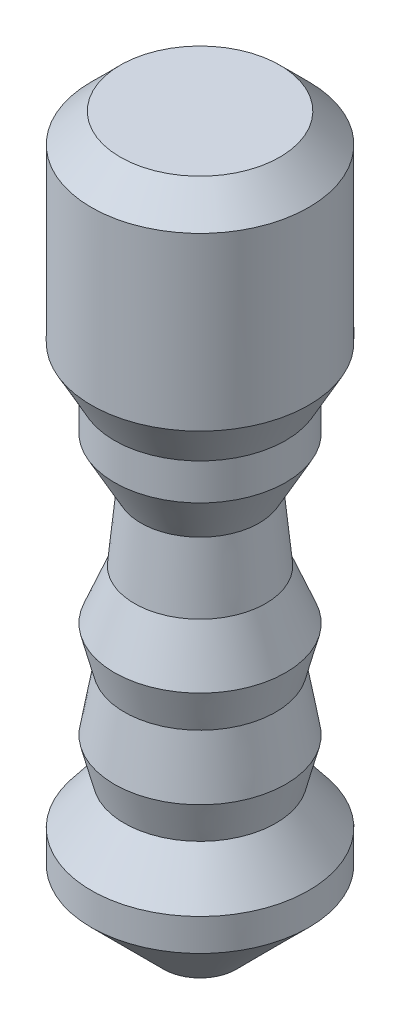
ISO-10303-21;
HEADER;
FILE_DESCRIPTION(('STEP AP214'),'2;1');
FILE_NAME('part.step','',(''),(''),'','','');
FILE_SCHEMA(('AUTOMOTIVE_DESIGN { 1 0 10303 214 1 1 1 1 }'));
ENDSEC;
DATA;
#1=APPLICATION_CONTEXT('core data for automotive mechanical design processes');
#2=APPLICATION_PROTOCOL_DEFINITION('international standard','automotive_design',2000,#1);
#3=PRODUCT_CONTEXT('',#1,'mechanical');
#4=PRODUCT('Part','Part','',(#3));
#5=PRODUCT_RELATED_PRODUCT_CATEGORY('part','',(#4));
#6=PRODUCT_DEFINITION_FORMATION('','',#4);
#7=PRODUCT_DEFINITION_CONTEXT('part definition',#1,'design');
#8=PRODUCT_DEFINITION('design','',#6,#7);
#9=PRODUCT_DEFINITION_SHAPE('','',#8);
#10=(LENGTH_UNIT() NAMED_UNIT(*) SI_UNIT(.MILLI.,.METRE.));
#11=(NAMED_UNIT(*) PLANE_ANGLE_UNIT() SI_UNIT($,.RADIAN.));
#12=(NAMED_UNIT(*) SI_UNIT($,.STERADIAN.) SOLID_ANGLE_UNIT());
#13=UNCERTAINTY_MEASURE_WITH_UNIT(LENGTH_MEASURE(1.E-05),#10,'distance_accuracy_value','');
#14=(GEOMETRIC_REPRESENTATION_CONTEXT(3) GLOBAL_UNCERTAINTY_ASSIGNED_CONTEXT((#13)) GLOBAL_UNIT_ASSIGNED_CONTEXT((#10,
#11,#12)) REPRESENTATION_CONTEXT('',''));
#15=CARTESIAN_POINT('',(0.,0.,0.));
#16=DIRECTION('',(0.,0.,1.));
#17=DIRECTION('',(1.,0.,0.));
#18=AXIS2_PLACEMENT_3D('',#15,#16,#17);
#19=CARTESIAN_POINT('',(0.,50.,0.));
#20=DIRECTION('',(0.,-1.,0.));
#21=DIRECTION('',(0.,0.,-1.));
#22=AXIS2_PLACEMENT_3D('',#19,#20,#21);
#23=CYLINDRICAL_SURFACE('',#22,7.5);
#24=CARTESIAN_POINT('',(0.,7.20813186441516,0.));
#25=DIRECTION('',(0.,-1.,0.));
#26=DIRECTION('',(0.,0.,-1.));
#27=AXIS2_PLACEMENT_3D('',#24,#25,#26);
#28=CIRCLE('',#27,7.5);
#29=CARTESIAN_POINT('',(0.,7.20813186441516,-7.5));
#30=VERTEX_POINT('',#29);
#31=EDGE_CURVE('E68',#30,#30,#28,.T.);
#32=ORIENTED_EDGE('',*,*,#31,.T.);
#33=EDGE_LOOP('',(#32));
#34=FACE_BOUND('',#33,.T.);
#35=CARTESIAN_POINT('',(0.,5.00000000000001,0.));
#36=DIRECTION('',(0.,1.,0.));
#37=DIRECTION('',(0.,0.,1.));
#38=AXIS2_PLACEMENT_3D('',#35,#36,#37);
#39=CIRCLE('',#38,7.5);
#40=CARTESIAN_POINT('',(0.,5.00000000000001,7.5));
#41=VERTEX_POINT('',#40);
#42=EDGE_CURVE('E62',#41,#41,#39,.T.);
#43=ORIENTED_EDGE('',*,*,#42,.T.);
#44=EDGE_LOOP('',(#43));
#45=FACE_BOUND('',#44,.T.);
#46=ADVANCED_FACE('F43',(#34,#45),#23,.T.);
#47=CARTESIAN_POINT('',(0.,0.,0.));
#48=DIRECTION('',(0.,1.,0.));
#49=DIRECTION('',(0.,0.,1.));
#50=AXIS2_PLACEMENT_3D('',#47,#48,#49);
#51=PLANE('',#50);
#52=CARTESIAN_POINT('',(0.,0.,0.));
#53=DIRECTION('',(0.,1.,0.));
#54=DIRECTION('',(0.,0.,1.));
#55=AXIS2_PLACEMENT_3D('',#52,#53,#54);
#56=CIRCLE('',#55,2.49999999999997);
#57=CARTESIAN_POINT('',(0.,0.,2.49999999999997));
#58=VERTEX_POINT('',#57);
#59=EDGE_CURVE('E57',#58,#58,#56,.F.);
#60=ORIENTED_EDGE('',*,*,#59,.T.);
#61=EDGE_LOOP('',(#60));
#62=FACE_BOUND('',#61,.T.);
#63=ADVANCED_FACE('F121',(#62),#51,.F.);
#64=CARTESIAN_POINT('',(0.,5.00000000000001,0.));
#65=DIRECTION('',(0.,1.,0.));
#66=DIRECTION('',(0.,0.,1.));
#67=AXIS2_PLACEMENT_3D('',#64,#65,#66);
#68=CONICAL_SURFACE('',#67,7.5,0.78539816339745);
#69=CARTESIAN_POINT('',(0.,0.,2.49999999999997));
#70=CARTESIAN_POINT('',(0.,0.0520833333333331,2.5520833333333));
#71=CARTESIAN_POINT('',(0.,0.104166666666667,2.60416666666664));
#72=CARTESIAN_POINT('',(0.,0.208333333333334,2.7083333333333));
#73=CARTESIAN_POINT('',(0.,0.260416666666667,2.76041666666664));
#74=CARTESIAN_POINT('',(0.,0.364583333333334,2.8645833333333));
#75=CARTESIAN_POINT('',(0.,0.416666666666668,2.91666666666664));
#76=CARTESIAN_POINT('',(0.,0.520833333333335,3.02083333333331));
#77=CARTESIAN_POINT('',(0.,0.572916666666668,3.07291666666664));
#78=CARTESIAN_POINT('',(0.,0.677083333333335,3.17708333333331));
#79=CARTESIAN_POINT('',(0.,0.729166666666668,3.22916666666664));
#80=CARTESIAN_POINT('',(0.,0.833333333333335,3.33333333333331));
#81=CARTESIAN_POINT('',(0.,0.885416666666668,3.38541666666664));
#82=CARTESIAN_POINT('',(0.,0.989583333333335,3.48958333333331));
#83=CARTESIAN_POINT('',(0.,1.04166666666667,3.54166666666664));
#84=CARTESIAN_POINT('',(0.,1.14583333333334,3.64583333333331));
#85=CARTESIAN_POINT('',(0.,1.19791666666667,3.69791666666664));
#86=CARTESIAN_POINT('',(0.,1.30208333333334,3.80208333333331));
#87=CARTESIAN_POINT('',(0.,1.35416666666667,3.85416666666664));
#88=CARTESIAN_POINT('',(0.,1.45833333333334,3.95833333333331));
#89=CARTESIAN_POINT('',(0.,1.51041666666667,4.01041666666664));
#90=CARTESIAN_POINT('',(0.,1.61458333333334,4.11458333333331));
#91=CARTESIAN_POINT('',(0.,1.66666666666667,4.16666666666665));
#92=CARTESIAN_POINT('',(0.,1.77083333333334,4.27083333333331));
#93=CARTESIAN_POINT('',(0.,1.82291666666667,4.32291666666665));
#94=CARTESIAN_POINT('',(0.,1.92708333333334,4.42708333333331));
#95=CARTESIAN_POINT('',(0.,1.97916666666667,4.47916666666665));
#96=CARTESIAN_POINT('',(0.,2.08333333333334,4.58333333333332));
#97=CARTESIAN_POINT('',(0.,2.13541666666667,4.63541666666665));
#98=CARTESIAN_POINT('',(0.,2.23958333333334,4.73958333333332));
#99=CARTESIAN_POINT('',(0.,2.29166666666667,4.79166666666665));
#100=CARTESIAN_POINT('',(0.,2.39583333333334,4.89583333333332));
#101=CARTESIAN_POINT('',(0.,2.44791666666667,4.94791666666665));
#102=CARTESIAN_POINT('',(0.,2.55208333333334,5.05208333333332));
#103=CARTESIAN_POINT('',(0.,2.60416666666667,5.10416666666665));
#104=CARTESIAN_POINT('',(0.,2.70833333333334,5.20833333333332));
#105=CARTESIAN_POINT('',(0.,2.76041666666667,5.26041666666665));
#106=CARTESIAN_POINT('',(0.,2.86458333333334,5.36458333333332));
#107=CARTESIAN_POINT('',(0.,2.91666666666667,5.41666666666665));
#108=CARTESIAN_POINT('',(0.,3.02083333333334,5.52083333333332));
#109=CARTESIAN_POINT('',(0.,3.07291666666667,5.57291666666665));
#110=CARTESIAN_POINT('',(0.,3.17708333333334,5.67708333333332));
#111=CARTESIAN_POINT('',(0.,3.22916666666667,5.72916666666665));
#112=CARTESIAN_POINT('',(0.,3.33333333333334,5.83333333333332));
#113=CARTESIAN_POINT('',(0.,3.38541666666667,5.88541666666666));
#114=CARTESIAN_POINT('',(0.,3.48958333333334,5.98958333333332));
#115=CARTESIAN_POINT('',(0.,3.54166666666667,6.04166666666666));
#116=CARTESIAN_POINT('',(0.,3.64583333333334,6.14583333333332));
#117=CARTESIAN_POINT('',(0.,3.69791666666667,6.19791666666666));
#118=CARTESIAN_POINT('',(0.,3.80208333333334,6.30208333333332));
#119=CARTESIAN_POINT('',(0.,3.85416666666667,6.35416666666666));
#120=CARTESIAN_POINT('',(0.,3.95833333333334,6.45833333333333));
#121=CARTESIAN_POINT('',(0.,4.01041666666667,6.51041666666666));
#122=CARTESIAN_POINT('',(0.,4.11458333333334,6.61458333333333));
#123=CARTESIAN_POINT('',(0.,4.16666666666667,6.66666666666666));
#124=CARTESIAN_POINT('',(0.,4.27083333333334,6.77083333333333));
#125=CARTESIAN_POINT('',(0.,4.32291666666668,6.82291666666666));
#126=CARTESIAN_POINT('',(0.,4.42708333333334,6.92708333333333));
#127=CARTESIAN_POINT('',(0.,4.47916666666668,6.97916666666666));
#128=CARTESIAN_POINT('',(0.,4.58333333333334,7.08333333333333));
#129=CARTESIAN_POINT('',(0.,4.63541666666668,7.13541666666666));
#130=CARTESIAN_POINT('',(0.,4.73958333333334,7.23958333333333));
#131=CARTESIAN_POINT('',(0.,4.79166666666668,7.29166666666666));
#132=CARTESIAN_POINT('',(0.,4.89583333333334,7.39583333333333));
#133=CARTESIAN_POINT('',(0.,4.94791666666668,7.44791666666667));
#134=CARTESIAN_POINT('',(0.,5.00000000000001,7.5));
#135=B_SPLINE_CURVE_WITH_KNOTS('',3,(#69,#70,#71,#72,#73,#74,#75,#76,#77,#78,#79,#80,#81,#82,
#83,#84,#85,#86,#87,#88,#89,#90,#91,#92,#93,#94,#95,#96,#97,#98,#99,#100,#101,#102,#103,#104,
#105,#106,#107,#108,#109,#110,#111,#112,#113,#114,#115,#116,#117,#118,#119,#120,#121,#122,#123,
#124,#125,#126,#127,#128,#129,#130,#131,#132,#133,#134),.UNSPECIFIED.,.F.,.F.,(4,2,2,2,2,2,2,2,
2,2,2,2,2,2,2,2,2,2,2,2,2,2,2,2,2,2,2,2,2,2,2,2,4),(0.,0.220970869120797,0.441941738241593,
0.662912607362391,0.883883476483188,1.10485434560399,1.32582521472478,1.54679608384558,
1.76776695296638,1.98873782208717,2.20970869120797,2.43067956032877,2.65165042944956,
2.87262129857036,3.09359216769116,3.31456303681196,3.53553390593275,3.75650477505355,
3.97747564417435,4.19844651329514,4.41941738241594,4.64038825153674,4.86135912065753,
5.08232998977833,5.30330085889913,5.52427172801992,5.74524259714072,5.96621346626152,
6.18718433538232,6.40815520450311,6.62912607362391,6.85009694274471,7.0710678118655),.UNSPECIFIED.);
#136=EDGE_CURVE('BSEAM126',#58,#41,#135,.T.);
#137=ORIENTED_EDGE('',*,*,#59,.F.);
#138=ORIENTED_EDGE('',*,*,#42,.F.);
#139=ORIENTED_EDGE('',*,*,#136,.T.);
#140=ORIENTED_EDGE('',*,*,#136,.F.);
#141=EDGE_LOOP('',(#137,#139,#138,#140));
#142=FACE_BOUND('',#141,.T.);
#143=ADVANCED_FACE('F126',(#142),#68,.T.);
#144=CARTESIAN_POINT('',(0.,10.0865747204222,0.));
#145=DIRECTION('',(0.,-1.,0.));
#146=DIRECTION('',(0.,0.,-1.));
#147=AXIS2_PLACEMENT_3D('',#144,#145,#146);
#148=CONICAL_SURFACE('',#147,5.22558542013019,0.668708691288029);
#149=ORIENTED_EDGE('',*,*,#31,.F.);
#150=EDGE_LOOP('',(#149));
#151=FACE_BOUND('',#150,.T.);
#152=CARTESIAN_POINT('',(0.,10.0865747204222,0.));
#153=DIRECTION('',(0.,-1.,0.));
#154=DIRECTION('',(0.,0.,-1.));
#155=AXIS2_PLACEMENT_3D('',#152,#153,#154);
#156=CIRCLE('',#155,5.22558542013019);
#157=CARTESIAN_POINT('',(0.,10.0865747204222,-5.22558542013019));
#158=VERTEX_POINT('',#157);
#159=EDGE_CURVE('E72',#158,#158,#156,.T.);
#160=ORIENTED_EDGE('',*,*,#159,.T.);
#161=EDGE_LOOP('',(#160));
#162=FACE_BOUND('',#161,.T.);
#163=ADVANCED_FACE('F133',(#151,#162),#148,.T.);
#164=CARTESIAN_POINT('',(0.,12.7536492053767,0.));
#165=DIRECTION('',(0.,1.,0.));
#166=DIRECTION('',(0.,0.,1.));
#167=AXIS2_PLACEMENT_3D('',#164,#165,#166);
#168=CONICAL_SURFACE('',#167,5.90861669066732,0.250709259421408);
#169=ORIENTED_EDGE('',*,*,#159,.F.);
#170=EDGE_LOOP('',(#169));
#171=FACE_BOUND('',#170,.T.);
#172=CARTESIAN_POINT('',(0.,12.7536492053767,0.));
#173=DIRECTION('',(0.,-1.,0.));
#174=DIRECTION('',(0.,0.,-1.));
#175=AXIS2_PLACEMENT_3D('',#172,#173,#174);
#176=CIRCLE('',#175,5.90861669066732);
#177=CARTESIAN_POINT('',(0.,12.7536492053767,-5.90861669066732));
#178=VERTEX_POINT('',#177);
#179=EDGE_CURVE('E76',#178,#178,#176,.T.);
#180=ORIENTED_EDGE('',*,*,#179,.T.);
#181=EDGE_LOOP('',(#180));
#182=FACE_BOUND('',#181,.T.);
#183=ADVANCED_FACE('F138',(#171,#182),#168,.T.);
#184=CARTESIAN_POINT('',(0.,16.7147330203492,0.));
#185=DIRECTION('',(0.,-1.,0.));
#186=DIRECTION('',(0.,0.,-1.));
#187=AXIS2_PLACEMENT_3D('',#184,#185,#186);
#188=CONICAL_SURFACE('',#187,5.21542702304713,0.173245666452364);
#189=ORIENTED_EDGE('',*,*,#179,.F.);
#190=EDGE_LOOP('',(#189));
#191=FACE_BOUND('',#190,.T.);
#192=CARTESIAN_POINT('',(0.,16.7147330203492,0.));
#193=DIRECTION('',(0.,-1.,0.));
#194=DIRECTION('',(0.,0.,-1.));
#195=AXIS2_PLACEMENT_3D('',#192,#193,#194);
#196=CIRCLE('',#195,5.21542702304713);
#197=CARTESIAN_POINT('',(0.,16.7147330203492,-5.21542702304713));
#198=VERTEX_POINT('',#197);
#199=EDGE_CURVE('E80',#198,#198,#196,.T.);
#200=ORIENTED_EDGE('',*,*,#199,.T.);
#201=EDGE_LOOP('',(#200));
#202=FACE_BOUND('',#201,.T.);
#203=ADVANCED_FACE('F150',(#191,#202),#188,.T.);
#204=CARTESIAN_POINT('',(0.,19.4214736272471,0.));
#205=DIRECTION('',(0.,1.,0.));
#206=DIRECTION('',(0.,0.,1.));
#207=AXIS2_PLACEMENT_3D('',#204,#205,#206);
#208=CONICAL_SURFACE('',#207,5.90861669066732,0.250709259421408);
#209=ORIENTED_EDGE('',*,*,#199,.F.);
#210=EDGE_LOOP('',(#209));
#211=FACE_BOUND('',#210,.T.);
#212=CARTESIAN_POINT('',(0.,19.4214736272471,0.));
#213=DIRECTION('',(0.,-1.,0.));
#214=DIRECTION('',(0.,0.,-1.));
#215=AXIS2_PLACEMENT_3D('',#212,#213,#214);
#216=CIRCLE('',#215,5.90861669066732);
#217=CARTESIAN_POINT('',(0.,19.4214736272471,-5.90861669066732));
#218=VERTEX_POINT('',#217);
#219=EDGE_CURVE('E84',#218,#218,#216,.T.);
#220=ORIENTED_EDGE('',*,*,#219,.T.);
#221=EDGE_LOOP('',(#220));
#222=FACE_BOUND('',#221,.T.);
#223=ADVANCED_FACE('F181',(#211,#222),#208,.T.);
#224=CARTESIAN_POINT('',(0.,22.8544129335566,0.));
#225=DIRECTION('',(0.,-1.,0.));
#226=DIRECTION('',(0.,0.,-1.));
#227=AXIS2_PLACEMENT_3D('',#224,#225,#226);
#228=CONICAL_SURFACE('',#227,4.52223735542695,0.383817623288567);
#229=ORIENTED_EDGE('',*,*,#219,.F.);
#230=EDGE_LOOP('',(#229));
#231=FACE_BOUND('',#230,.T.);
#232=CARTESIAN_POINT('',(0.,22.8544129335566,0.));
#233=DIRECTION('',(0.,-1.,0.));
#234=DIRECTION('',(0.,0.,-1.));
#235=AXIS2_PLACEMENT_3D('',#232,#233,#234);
#236=CIRCLE('',#235,4.52223735542695);
#237=CARTESIAN_POINT('',(0.,22.8544129335566,-4.52223735542695));
#238=VERTEX_POINT('',#237);
#239=EDGE_CURVE('E88',#238,#238,#236,.T.);
#240=ORIENTED_EDGE('',*,*,#239,.T.);
#241=EDGE_LOOP('',(#240));
#242=FACE_BOUND('',#241,.T.);
#243=ADVANCED_FACE('F177',(#231,#242),#228,.T.);
#244=CARTESIAN_POINT('',(0.,27.4406733925262,0.));
#245=DIRECTION('',(0.,-1.,0.));
#246=DIRECTION('',(0.,0.,-1.));
#247=AXIS2_PLACEMENT_3D('',#244,#245,#246);
#248=CONICAL_SURFACE('',#247,4.08104973217698,0.0959025807789472);
#249=ORIENTED_EDGE('',*,*,#239,.F.);
#250=EDGE_LOOP('',(#249));
#251=FACE_BOUND('',#250,.T.);
#252=CARTESIAN_POINT('',(0.,27.4406733925262,0.));
#253=DIRECTION('',(0.,-1.,0.));
#254=DIRECTION('',(0.,0.,-1.));
#255=AXIS2_PLACEMENT_3D('',#252,#253,#254);
#256=CIRCLE('',#255,4.08104973217698);
#257=CARTESIAN_POINT('',(0.,27.4406733925262,-4.08104973217698));
#258=VERTEX_POINT('',#257);
#259=EDGE_CURVE('E92',#258,#258,#256,.T.);
#260=ORIENTED_EDGE('',*,*,#259,.T.);
#261=EDGE_LOOP('',(#260));
#262=FACE_BOUND('',#261,.T.);
#263=ADVANCED_FACE('F173',(#251,#262),#248,.T.);
#264=CARTESIAN_POINT('',(0.,30.7765805635016,0.));
#265=DIRECTION('',(0.,1.,0.));
#266=DIRECTION('',(0.,0.,1.));
#267=AXIS2_PLACEMENT_3D('',#264,#265,#266);
#268=CONICAL_SURFACE('',#267,5.90861669066732,0.50118878456502);
#269=ORIENTED_EDGE('',*,*,#259,.F.);
#270=EDGE_LOOP('',(#269));
#271=FACE_BOUND('',#270,.T.);
#272=CARTESIAN_POINT('',(0.,30.7765805635016,0.));
#273=DIRECTION('',(0.,-1.,0.));
#274=DIRECTION('',(0.,0.,-1.));
#275=AXIS2_PLACEMENT_3D('',#272,#273,#274);
#276=CIRCLE('',#275,5.90861669066732);
#277=CARTESIAN_POINT('',(0.,30.7765805635016,-5.90861669066732));
#278=VERTEX_POINT('',#277);
#279=EDGE_CURVE('E96',#278,#278,#276,.T.);
#280=ORIENTED_EDGE('',*,*,#279,.T.);
#281=EDGE_LOOP('',(#280));
#282=FACE_BOUND('',#281,.T.);
#283=ADVANCED_FACE('F166',(#271,#282),#268,.T.);
#284=CARTESIAN_POINT('',(0.,0.,0.));
#285=DIRECTION('',(0.,-1.,0.));
#286=DIRECTION('',(0.,0.,-1.));
#287=AXIS2_PLACEMENT_3D('',#284,#285,#286);
#288=CYLINDRICAL_SURFACE('',#287,5.90861669066732);
#289=ORIENTED_EDGE('',*,*,#279,.F.);
#290=EDGE_LOOP('',(#289));
#291=FACE_BOUND('',#290,.T.);
#292=CARTESIAN_POINT('',(0.,33.2852669796508,0.));
#293=DIRECTION('',(0.,-1.,0.));
#294=DIRECTION('',(0.,0.,-1.));
#295=AXIS2_PLACEMENT_3D('',#292,#293,#294);
#296=CIRCLE('',#295,5.90861669066732);
#297=CARTESIAN_POINT('',(0.,33.2852669796508,-5.90861669066732));
#298=VERTEX_POINT('',#297);
#299=EDGE_CURVE('E100',#298,#298,#296,.T.);
#300=ORIENTED_EDGE('',*,*,#299,.T.);
#301=EDGE_LOOP('',(#300));
#302=FACE_BOUND('',#301,.T.);
#303=ADVANCED_FACE('F160',(#291,#302),#288,.T.);
#304=CARTESIAN_POINT('',(0.,36.1900617772973,0.));
#305=DIRECTION('',(0.,1.,0.));
#306=DIRECTION('',(0.,0.,1.));
#307=AXIS2_PLACEMENT_3D('',#304,#305,#306);
#308=CONICAL_SURFACE('',#307,7.5,0.50118878456502);
#309=ORIENTED_EDGE('',*,*,#299,.F.);
#310=EDGE_LOOP('',(#309));
#311=FACE_BOUND('',#310,.T.);
#312=CARTESIAN_POINT('',(0.,36.1900617772973,0.));
#313=DIRECTION('',(0.,-1.,0.));
#314=DIRECTION('',(0.,0.,-1.));
#315=AXIS2_PLACEMENT_3D('',#312,#313,#314);
#316=CIRCLE('',#315,7.5);
#317=CARTESIAN_POINT('',(0.,36.1900617772973,-7.5));
#318=VERTEX_POINT('',#317);
#319=EDGE_CURVE('E104',#318,#318,#316,.T.);
#320=ORIENTED_EDGE('',*,*,#319,.T.);
#321=EDGE_LOOP('',(#320));
#322=FACE_BOUND('',#321,.T.);
#323=ADVANCED_FACE('F109',(#311,#322),#308,.T.);
#324=CARTESIAN_POINT('',(0.,50.,0.));
#325=DIRECTION('',(0.,1.,0.));
#326=DIRECTION('',(0.,0.,1.));
#327=AXIS2_PLACEMENT_3D('',#324,#325,#326);
#328=PLANE('',#327);
#329=CARTESIAN_POINT('',(0.,50.,0.));
#330=DIRECTION('',(0.,1.,0.));
#331=DIRECTION('',(0.,0.,1.));
#332=AXIS2_PLACEMENT_3D('',#329,#330,#331);
#333=CIRCLE('',#332,5.49999999999999);
#334=CARTESIAN_POINT('',(0.,50.,5.49999999999999));
#335=VERTEX_POINT('',#334);
#336=EDGE_CURVE('E52',#335,#335,#333,.T.);
#337=ORIENTED_EDGE('',*,*,#336,.T.);
#338=EDGE_LOOP('',(#337));
#339=FACE_BOUND('',#338,.T.);
#340=ADVANCED_FACE('F117',(#339),#328,.T.);
#341=CARTESIAN_POINT('',(0.,50.,0.));
#342=DIRECTION('',(0.,-1.,0.));
#343=DIRECTION('',(0.,0.,-1.));
#344=AXIS2_PLACEMENT_3D('',#341,#342,#343);
#345=CONICAL_SURFACE('',#344,5.49999999999999,0.785398163397447);
#346=CARTESIAN_POINT('',(0.,48.,0.));
#347=DIRECTION('',(0.,1.,0.));
#348=DIRECTION('',(0.,0.,1.));
#349=AXIS2_PLACEMENT_3D('',#346,#347,#348);
#350=CIRCLE('',#349,7.5);
#351=CARTESIAN_POINT('',(0.,48.,7.5));
#352=VERTEX_POINT('',#351);
#353=EDGE_CURVE('E10',#352,#352,#350,.F.);
#354=ORIENTED_EDGE('',*,*,#353,.F.);
#355=EDGE_LOOP('',(#354));
#356=FACE_BOUND('',#355,.T.);
#357=ORIENTED_EDGE('',*,*,#336,.F.);
#358=EDGE_LOOP('',(#357));
#359=FACE_BOUND('',#358,.T.);
#360=ADVANCED_FACE('F46',(#356,#359),#345,.T.);
#361=ORIENTED_EDGE('',*,*,#319,.F.);
#362=EDGE_LOOP('',(#361));
#363=FACE_BOUND('',#362,.T.);
#364=ORIENTED_EDGE('',*,*,#353,.T.);
#365=EDGE_LOOP('',(#364));
#366=FACE_BOUND('',#365,.T.);
#367=ADVANCED_FACE('F111',(#363,#366),#23,.T.);
#368=CLOSED_SHELL('',(#46,#63,#143,#163,#183,#203,#223,#243,#263,#283,#303,#323,#340,#360,#367));
#369=MANIFOLD_SOLID_BREP('B2',#368);
#370=ADVANCED_BREP_SHAPE_REPRESENTATION('',(#18,#369),#14);
#371=SHAPE_DEFINITION_REPRESENTATION(#9,#370);
ENDSEC;
END-ISO-10303-21;
